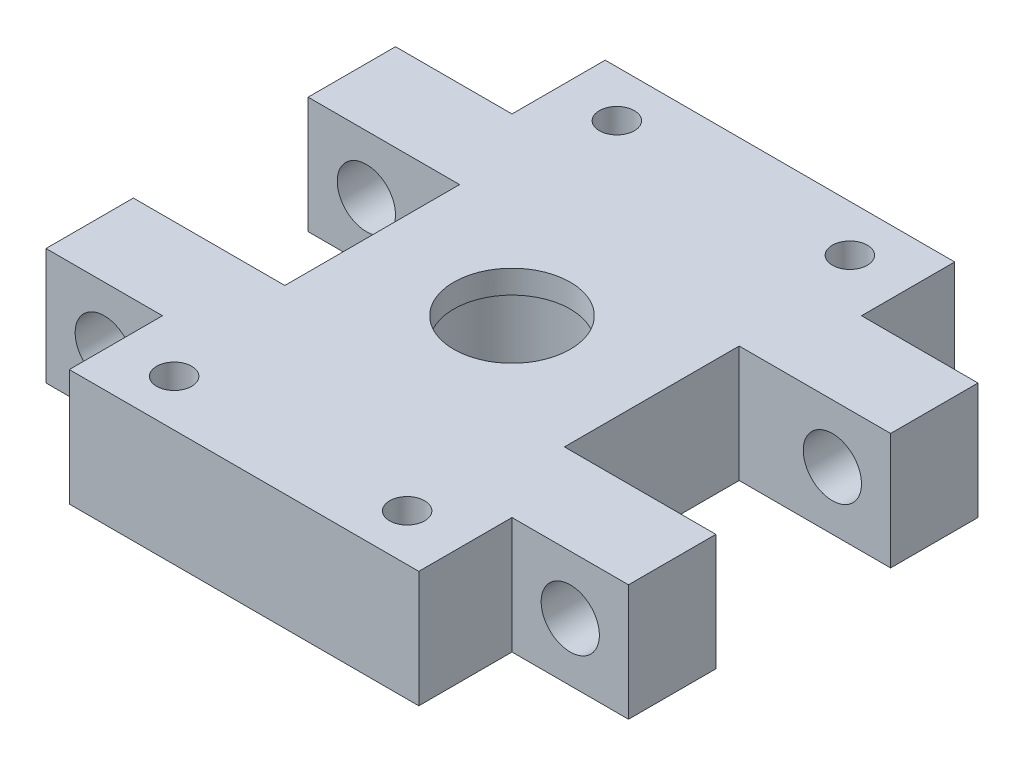
ISO-10303-21;
HEADER;
FILE_DESCRIPTION(('STEP AP214'),'2;1');
FILE_NAME('part.step','',(''),(''),'','','');
FILE_SCHEMA(('AUTOMOTIVE_DESIGN { 1 0 10303 214 1 1 1 1 }'));
ENDSEC;
DATA;
#1=APPLICATION_CONTEXT('core data for automotive mechanical design processes');
#2=APPLICATION_PROTOCOL_DEFINITION('international standard','automotive_design',2000,#1);
#3=PRODUCT_CONTEXT('',#1,'mechanical');
#4=PRODUCT('Part','Part','',(#3));
#5=PRODUCT_RELATED_PRODUCT_CATEGORY('part','',(#4));
#6=PRODUCT_DEFINITION_FORMATION('','',#4);
#7=PRODUCT_DEFINITION_CONTEXT('part definition',#1,'design');
#8=PRODUCT_DEFINITION('design','',#6,#7);
#9=PRODUCT_DEFINITION_SHAPE('','',#8);
#10=(LENGTH_UNIT() NAMED_UNIT(*) SI_UNIT(.MILLI.,.METRE.));
#11=(NAMED_UNIT(*) PLANE_ANGLE_UNIT() SI_UNIT($,.RADIAN.));
#12=(NAMED_UNIT(*) SI_UNIT($,.STERADIAN.) SOLID_ANGLE_UNIT());
#13=UNCERTAINTY_MEASURE_WITH_UNIT(LENGTH_MEASURE(1.E-05),#10,'distance_accuracy_value','');
#14=(GEOMETRIC_REPRESENTATION_CONTEXT(3) GLOBAL_UNCERTAINTY_ASSIGNED_CONTEXT((#13)) GLOBAL_UNIT_ASSIGNED_CONTEXT((#10,
#11,#12)) REPRESENTATION_CONTEXT('',''));
#15=CARTESIAN_POINT('',(0.,0.,0.));
#16=DIRECTION('',(0.,0.,1.));
#17=DIRECTION('',(1.,0.,0.));
#18=AXIS2_PLACEMENT_3D('',#15,#16,#17);
#19=CARTESIAN_POINT('',(0.,5.,0.));
#20=DIRECTION('',(0.,-1.,0.));
#21=DIRECTION('',(0.,0.,-1.));
#22=AXIS2_PLACEMENT_3D('',#19,#20,#21);
#23=CYLINDRICAL_SURFACE('',#22,5.);
#24=CARTESIAN_POINT('',(0.,5.,0.));
#25=DIRECTION('',(0.,1.,0.));
#26=DIRECTION('',(0.,0.,1.));
#27=AXIS2_PLACEMENT_3D('',#24,#25,#26);
#28=CIRCLE('',#27,5.);
#29=CARTESIAN_POINT('',(0.,5.,5.));
#30=VERTEX_POINT('',#29);
#31=EDGE_CURVE('E214',#30,#30,#28,.T.);
#32=ORIENTED_EDGE('',*,*,#31,.T.);
#33=EDGE_LOOP('',(#32));
#34=FACE_BOUND('',#33,.T.);
#35=CARTESIAN_POINT('',(0.,3.,0.));
#36=DIRECTION('',(0.,-1.,0.));
#37=DIRECTION('',(0.,0.,-1.));
#38=AXIS2_PLACEMENT_3D('',#35,#36,#37);
#39=CIRCLE('',#38,5.);
#40=CARTESIAN_POINT('',(0.,3.,-5.));
#41=VERTEX_POINT('',#40);
#42=EDGE_CURVE('E42',#41,#41,#39,.T.);
#43=ORIENTED_EDGE('',*,*,#42,.T.);
#44=EDGE_LOOP('',(#43));
#45=FACE_BOUND('',#44,.T.);
#46=ADVANCED_FACE('F38',(#34,#45),#23,.F.);
#47=CARTESIAN_POINT('',(0.,5.,0.));
#48=DIRECTION('',(0.,1.,0.));
#49=DIRECTION('',(0.,0.,1.));
#50=AXIS2_PLACEMENT_3D('',#47,#48,#49);
#51=PLANE('',#50);
#52=CARTESIAN_POINT('',(-9.99999999999998,5.,-19.));
#53=DIRECTION('',(0.,1.,0.));
#54=DIRECTION('',(0.,0.,-1.));
#55=AXIS2_PLACEMENT_3D('',#52,#53,#54);
#56=CIRCLE('',#55,1.5);
#57=CARTESIAN_POINT('',(-9.99999999999998,5.,-20.5));
#58=VERTEX_POINT('',#57);
#59=EDGE_CURVE('E717',#58,#58,#56,.T.);
#60=ORIENTED_EDGE('',*,*,#59,.F.);
#61=EDGE_LOOP('',(#60));
#62=FACE_BOUND('',#61,.T.);
#63=CARTESIAN_POINT('',(10.,5.,19.));
#64=DIRECTION('',(0.,1.,0.));
#65=DIRECTION('',(0.,0.,-1.));
#66=AXIS2_PLACEMENT_3D('',#63,#64,#65);
#67=CIRCLE('',#66,1.5);
#68=CARTESIAN_POINT('',(10.,5.,17.5));
#69=VERTEX_POINT('',#68);
#70=EDGE_CURVE('E720',#69,#69,#67,.T.);
#71=ORIENTED_EDGE('',*,*,#70,.F.);
#72=EDGE_LOOP('',(#71));
#73=FACE_BOUND('',#72,.T.);
#74=CARTESIAN_POINT('',(-9.99999999999998,5.,19.));
#75=DIRECTION('',(0.,1.,0.));
#76=DIRECTION('',(0.,0.,1.));
#77=AXIS2_PLACEMENT_3D('',#74,#75,#76);
#78=CIRCLE('',#77,1.5);
#79=CARTESIAN_POINT('',(-9.99999999999998,5.,20.5));
#80=VERTEX_POINT('',#79);
#81=EDGE_CURVE('E731',#80,#80,#78,.T.);
#82=ORIENTED_EDGE('',*,*,#81,.F.);
#83=EDGE_LOOP('',(#82));
#84=FACE_BOUND('',#83,.T.);
#85=CARTESIAN_POINT('',(10.,5.,-19.));
#86=DIRECTION('',(0.,1.,0.));
#87=DIRECTION('',(0.,0.,1.));
#88=AXIS2_PLACEMENT_3D('',#85,#86,#87);
#89=CIRCLE('',#88,1.5);
#90=CARTESIAN_POINT('',(10.,5.,-17.5));
#91=VERTEX_POINT('',#90);
#92=EDGE_CURVE('E423',#91,#91,#89,.T.);
#93=ORIENTED_EDGE('',*,*,#92,.F.);
#94=EDGE_LOOP('',(#93));
#95=FACE_BOUND('',#94,.T.);
#96=DIRECTION('',(0.,0.,-1.));
#97=VECTOR('',#96,1.);
#98=CARTESIAN_POINT('',(25.,5.,7.5));
#99=LINE('',#98,#97);
#100=CARTESIAN_POINT('',(25.,5.,15.));
#101=VERTEX_POINT('',#100);
#102=CARTESIAN_POINT('',(25.,5.,7.5));
#103=VERTEX_POINT('',#102);
#104=EDGE_CURVE('E249',#101,#103,#99,.T.);
#105=ORIENTED_EDGE('',*,*,#104,.T.);
#106=DIRECTION('',(-1.,0.,0.));
#107=VECTOR('',#106,1.);
#108=CARTESIAN_POINT('',(12.,5.,7.5));
#109=LINE('',#108,#107);
#110=CARTESIAN_POINT('',(12.,5.,7.5));
#111=VERTEX_POINT('',#110);
#112=EDGE_CURVE('E136',#103,#111,#109,.T.);
#113=ORIENTED_EDGE('',*,*,#112,.T.);
#114=DIRECTION('',(0.,0.,-1.));
#115=VECTOR('',#114,1.);
#116=CARTESIAN_POINT('',(12.,5.,-7.5));
#117=LINE('',#116,#115);
#118=CARTESIAN_POINT('',(12.,5.,-7.5));
#119=VERTEX_POINT('',#118);
#120=EDGE_CURVE('E324',#111,#119,#117,.T.);
#121=ORIENTED_EDGE('',*,*,#120,.T.);
#122=DIRECTION('',(1.,0.,0.));
#123=VECTOR('',#122,1.);
#124=CARTESIAN_POINT('',(12.,5.,-7.5));
#125=LINE('',#124,#123);
#126=CARTESIAN_POINT('',(25.,5.,-7.5));
#127=VERTEX_POINT('',#126);
#128=EDGE_CURVE('E326',#119,#127,#125,.T.);
#129=ORIENTED_EDGE('',*,*,#128,.T.);
#130=DIRECTION('',(0.,0.,-1.));
#131=VECTOR('',#130,1.);
#132=CARTESIAN_POINT('',(25.,5.,-15.));
#133=LINE('',#132,#131);
#134=CARTESIAN_POINT('',(25.,5.,-15.));
#135=VERTEX_POINT('',#134);
#136=EDGE_CURVE('E328',#127,#135,#133,.T.);
#137=ORIENTED_EDGE('',*,*,#136,.T.);
#138=DIRECTION('',(-1.,0.,0.));
#139=VECTOR('',#138,1.);
#140=CARTESIAN_POINT('',(15.,5.,-15.));
#141=LINE('',#140,#139);
#142=CARTESIAN_POINT('',(15.,5.,-15.));
#143=VERTEX_POINT('',#142);
#144=EDGE_CURVE('E330',#135,#143,#141,.T.);
#145=ORIENTED_EDGE('',*,*,#144,.T.);
#146=DIRECTION('',(0.,0.,-1.));
#147=VECTOR('',#146,1.);
#148=CARTESIAN_POINT('',(15.,5.,-23.));
#149=LINE('',#148,#147);
#150=CARTESIAN_POINT('',(15.,5.,-23.));
#151=VERTEX_POINT('',#150);
#152=EDGE_CURVE('E332',#143,#151,#149,.T.);
#153=ORIENTED_EDGE('',*,*,#152,.T.);
#154=DIRECTION('',(-1.,0.,0.));
#155=VECTOR('',#154,1.);
#156=CARTESIAN_POINT('',(-15.,5.,-23.));
#157=LINE('',#156,#155);
#158=CARTESIAN_POINT('',(-15.,5.,-23.));
#159=VERTEX_POINT('',#158);
#160=EDGE_CURVE('E334',#151,#159,#157,.T.);
#161=ORIENTED_EDGE('',*,*,#160,.T.);
#162=DIRECTION('',(0.,0.,1.));
#163=VECTOR('',#162,1.);
#164=CARTESIAN_POINT('',(-15.,5.,-15.));
#165=LINE('',#164,#163);
#166=CARTESIAN_POINT('',(-15.,5.,-15.));
#167=VERTEX_POINT('',#166);
#168=EDGE_CURVE('E336',#159,#167,#165,.T.);
#169=ORIENTED_EDGE('',*,*,#168,.T.);
#170=DIRECTION('',(-1.,0.,0.));
#171=VECTOR('',#170,1.);
#172=CARTESIAN_POINT('',(-25.,5.,-15.));
#173=LINE('',#172,#171);
#174=CARTESIAN_POINT('',(-25.,5.,-15.));
#175=VERTEX_POINT('',#174);
#176=EDGE_CURVE('E338',#167,#175,#173,.T.);
#177=ORIENTED_EDGE('',*,*,#176,.T.);
#178=DIRECTION('',(0.,0.,1.));
#179=VECTOR('',#178,1.);
#180=CARTESIAN_POINT('',(-25.,5.,-15.));
#181=LINE('',#180,#179);
#182=CARTESIAN_POINT('',(-25.,5.,-7.49999999999999));
#183=VERTEX_POINT('',#182);
#184=EDGE_CURVE('E340',#175,#183,#181,.T.);
#185=ORIENTED_EDGE('',*,*,#184,.T.);
#186=DIRECTION('',(1.,0.,0.));
#187=VECTOR('',#186,1.);
#188=CARTESIAN_POINT('',(-12.,5.,-7.5));
#189=LINE('',#188,#187);
#190=CARTESIAN_POINT('',(-12.,5.,-7.5));
#191=VERTEX_POINT('',#190);
#192=EDGE_CURVE('E342',#183,#191,#189,.T.);
#193=ORIENTED_EDGE('',*,*,#192,.T.);
#194=DIRECTION('',(0.,0.,1.));
#195=VECTOR('',#194,1.);
#196=CARTESIAN_POINT('',(-12.,5.,-7.5));
#197=LINE('',#196,#195);
#198=CARTESIAN_POINT('',(-12.,5.,7.5));
#199=VERTEX_POINT('',#198);
#200=EDGE_CURVE('E344',#191,#199,#197,.T.);
#201=ORIENTED_EDGE('',*,*,#200,.T.);
#202=DIRECTION('',(-1.,0.,0.));
#203=VECTOR('',#202,1.);
#204=CARTESIAN_POINT('',(-12.,5.,7.5));
#205=LINE('',#204,#203);
#206=CARTESIAN_POINT('',(-25.,5.,7.49999999999999));
#207=VERTEX_POINT('',#206);
#208=EDGE_CURVE('E346',#199,#207,#205,.T.);
#209=ORIENTED_EDGE('',*,*,#208,.T.);
#210=DIRECTION('',(0.,0.,1.));
#211=VECTOR('',#210,1.);
#212=CARTESIAN_POINT('',(-25.,5.,7.49999999999999));
#213=LINE('',#212,#211);
#214=CARTESIAN_POINT('',(-25.,5.,15.));
#215=VERTEX_POINT('',#214);
#216=EDGE_CURVE('E348',#207,#215,#213,.T.);
#217=ORIENTED_EDGE('',*,*,#216,.T.);
#218=DIRECTION('',(1.,0.,0.));
#219=VECTOR('',#218,1.);
#220=CARTESIAN_POINT('',(-25.,5.,15.));
#221=LINE('',#220,#219);
#222=CARTESIAN_POINT('',(-15.,5.,15.));
#223=VERTEX_POINT('',#222);
#224=EDGE_CURVE('E350',#215,#223,#221,.T.);
#225=ORIENTED_EDGE('',*,*,#224,.T.);
#226=DIRECTION('',(0.,0.,1.));
#227=VECTOR('',#226,1.);
#228=CARTESIAN_POINT('',(-15.,5.,15.));
#229=LINE('',#228,#227);
#230=CARTESIAN_POINT('',(-15.,5.,23.));
#231=VERTEX_POINT('',#230);
#232=EDGE_CURVE('E192',#223,#231,#229,.T.);
#233=ORIENTED_EDGE('',*,*,#232,.T.);
#234=DIRECTION('',(1.,0.,0.));
#235=VECTOR('',#234,1.);
#236=CARTESIAN_POINT('',(-15.,5.,23.));
#237=LINE('',#236,#235);
#238=CARTESIAN_POINT('',(15.,5.,23.));
#239=VERTEX_POINT('',#238);
#240=EDGE_CURVE('E185',#231,#239,#237,.T.);
#241=ORIENTED_EDGE('',*,*,#240,.T.);
#242=DIRECTION('',(0.,0.,-1.));
#243=VECTOR('',#242,1.);
#244=CARTESIAN_POINT('',(15.,5.,23.));
#245=LINE('',#244,#243);
#246=CARTESIAN_POINT('',(15.,5.,15.));
#247=VERTEX_POINT('',#246);
#248=EDGE_CURVE('E190',#239,#247,#245,.T.);
#249=ORIENTED_EDGE('',*,*,#248,.T.);
#250=DIRECTION('',(1.,0.,0.));
#251=VECTOR('',#250,1.);
#252=CARTESIAN_POINT('',(15.,5.,15.));
#253=LINE('',#252,#251);
#254=EDGE_CURVE('E57',#247,#101,#253,.T.);
#255=ORIENTED_EDGE('',*,*,#254,.T.);
#256=EDGE_LOOP('',(#105,#113,#121,#129,#137,#145,#153,#161,#169,#177,#185,#193,#201,#209,#217,
#225,#233,#241,#249,#255));
#257=FACE_BOUND('',#256,.T.);
#258=ORIENTED_EDGE('',*,*,#31,.F.);
#259=EDGE_LOOP('',(#258));
#260=FACE_BOUND('',#259,.T.);
#261=ADVANCED_FACE('F187',(#62,#73,#84,#95,#257,#260),#51,.T.);
#262=CARTESIAN_POINT('',(0.,-5.,0.));
#263=DIRECTION('',(0.,1.,0.));
#264=DIRECTION('',(0.,0.,1.));
#265=AXIS2_PLACEMENT_3D('',#262,#263,#264);
#266=PLANE('',#265);
#267=CARTESIAN_POINT('',(-9.99999999999998,-5.,-19.));
#268=DIRECTION('',(0.,1.,0.));
#269=DIRECTION('',(0.,0.,-1.));
#270=AXIS2_PLACEMENT_3D('',#267,#268,#269);
#271=CIRCLE('',#270,1.5);
#272=CARTESIAN_POINT('',(-9.99999999999998,-5.,-20.5));
#273=VERTEX_POINT('',#272);
#274=EDGE_CURVE('E402',#273,#273,#271,.T.);
#275=ORIENTED_EDGE('',*,*,#274,.T.);
#276=EDGE_LOOP('',(#275));
#277=FACE_BOUND('',#276,.T.);
#278=CARTESIAN_POINT('',(10.,-5.,19.));
#279=DIRECTION('',(0.,1.,0.));
#280=DIRECTION('',(0.,0.,-1.));
#281=AXIS2_PLACEMENT_3D('',#278,#279,#280);
#282=CIRCLE('',#281,1.5);
#283=CARTESIAN_POINT('',(10.,-5.,17.5));
#284=VERTEX_POINT('',#283);
#285=EDGE_CURVE('E406',#284,#284,#282,.T.);
#286=ORIENTED_EDGE('',*,*,#285,.T.);
#287=EDGE_LOOP('',(#286));
#288=FACE_BOUND('',#287,.T.);
#289=CARTESIAN_POINT('',(-9.99999999999998,-5.,19.));
#290=DIRECTION('',(0.,1.,0.));
#291=DIRECTION('',(0.,0.,1.));
#292=AXIS2_PLACEMENT_3D('',#289,#290,#291);
#293=CIRCLE('',#292,1.5);
#294=CARTESIAN_POINT('',(-9.99999999999998,-5.,20.5));
#295=VERTEX_POINT('',#294);
#296=EDGE_CURVE('E410',#295,#295,#293,.T.);
#297=ORIENTED_EDGE('',*,*,#296,.T.);
#298=EDGE_LOOP('',(#297));
#299=FACE_BOUND('',#298,.T.);
#300=CARTESIAN_POINT('',(10.,-5.,-19.));
#301=DIRECTION('',(0.,1.,0.));
#302=DIRECTION('',(0.,0.,1.));
#303=AXIS2_PLACEMENT_3D('',#300,#301,#302);
#304=CIRCLE('',#303,1.5);
#305=CARTESIAN_POINT('',(10.,-5.,-17.5));
#306=VERTEX_POINT('',#305);
#307=EDGE_CURVE('E414',#306,#306,#304,.T.);
#308=ORIENTED_EDGE('',*,*,#307,.T.);
#309=EDGE_LOOP('',(#308));
#310=FACE_BOUND('',#309,.T.);
#311=CARTESIAN_POINT('',(0.,-5.,0.));
#312=DIRECTION('',(0.,-1.,0.));
#313=DIRECTION('',(0.,0.,-1.));
#314=AXIS2_PLACEMENT_3D('',#311,#312,#313);
#315=CIRCLE('',#314,6.);
#316=CARTESIAN_POINT('',(0.,-5.,-6.));
#317=VERTEX_POINT('',#316);
#318=EDGE_CURVE('E417',#317,#317,#315,.T.);
#319=ORIENTED_EDGE('',*,*,#318,.F.);
#320=EDGE_LOOP('',(#319));
#321=FACE_BOUND('',#320,.T.);
#322=DIRECTION('',(0.,0.,-1.));
#323=VECTOR('',#322,1.);
#324=CARTESIAN_POINT('',(25.,-5.,7.5));
#325=LINE('',#324,#323);
#326=CARTESIAN_POINT('',(25.,-5.,15.));
#327=VERTEX_POINT('',#326);
#328=CARTESIAN_POINT('',(25.,-5.,7.5));
#329=VERTEX_POINT('',#328);
#330=EDGE_CURVE('E210',#327,#329,#325,.T.);
#331=ORIENTED_EDGE('',*,*,#330,.F.);
#332=DIRECTION('',(1.,0.,0.));
#333=VECTOR('',#332,1.);
#334=CARTESIAN_POINT('',(15.,-5.,15.));
#335=LINE('',#334,#333);
#336=CARTESIAN_POINT('',(15.,-5.,15.));
#337=VERTEX_POINT('',#336);
#338=EDGE_CURVE('E128',#337,#327,#335,.T.);
#339=ORIENTED_EDGE('',*,*,#338,.F.);
#340=DIRECTION('',(0.,0.,-1.));
#341=VECTOR('',#340,1.);
#342=CARTESIAN_POINT('',(15.,-5.,23.));
#343=LINE('',#342,#341);
#344=CARTESIAN_POINT('',(15.,-5.,23.));
#345=VERTEX_POINT('',#344);
#346=EDGE_CURVE('E122',#345,#337,#343,.T.);
#347=ORIENTED_EDGE('',*,*,#346,.F.);
#348=DIRECTION('',(1.,0.,0.));
#349=VECTOR('',#348,1.);
#350=CARTESIAN_POINT('',(-15.,-5.,23.));
#351=LINE('',#350,#349);
#352=CARTESIAN_POINT('',(-15.,-5.,23.));
#353=VERTEX_POINT('',#352);
#354=EDGE_CURVE('E200',#353,#345,#351,.T.);
#355=ORIENTED_EDGE('',*,*,#354,.F.);
#356=DIRECTION('',(0.,0.,1.));
#357=VECTOR('',#356,1.);
#358=CARTESIAN_POINT('',(-15.,-5.,15.));
#359=LINE('',#358,#357);
#360=CARTESIAN_POINT('',(-15.,-5.,15.));
#361=VERTEX_POINT('',#360);
#362=EDGE_CURVE('E244',#361,#353,#359,.T.);
#363=ORIENTED_EDGE('',*,*,#362,.F.);
#364=DIRECTION('',(1.,0.,0.));
#365=VECTOR('',#364,1.);
#366=CARTESIAN_POINT('',(-25.,-5.,15.));
#367=LINE('',#366,#365);
#368=CARTESIAN_POINT('',(-25.,-5.,15.));
#369=VERTEX_POINT('',#368);
#370=EDGE_CURVE('E242',#369,#361,#367,.T.);
#371=ORIENTED_EDGE('',*,*,#370,.F.);
#372=DIRECTION('',(0.,0.,1.));
#373=VECTOR('',#372,1.);
#374=CARTESIAN_POINT('',(-25.,-5.,7.49999999999999));
#375=LINE('',#374,#373);
#376=CARTESIAN_POINT('',(-25.,-5.,7.49999999999999));
#377=VERTEX_POINT('',#376);
#378=EDGE_CURVE('E240',#377,#369,#375,.T.);
#379=ORIENTED_EDGE('',*,*,#378,.F.);
#380=DIRECTION('',(-1.,0.,0.));
#381=VECTOR('',#380,1.);
#382=CARTESIAN_POINT('',(-12.,-5.,7.5));
#383=LINE('',#382,#381);
#384=CARTESIAN_POINT('',(-12.,-5.,7.5));
#385=VERTEX_POINT('',#384);
#386=EDGE_CURVE('E238',#385,#377,#383,.T.);
#387=ORIENTED_EDGE('',*,*,#386,.F.);
#388=DIRECTION('',(0.,0.,1.));
#389=VECTOR('',#388,1.);
#390=CARTESIAN_POINT('',(-12.,-5.,-7.5));
#391=LINE('',#390,#389);
#392=CARTESIAN_POINT('',(-12.,-5.,-7.5));
#393=VERTEX_POINT('',#392);
#394=EDGE_CURVE('E236',#393,#385,#391,.T.);
#395=ORIENTED_EDGE('',*,*,#394,.F.);
#396=DIRECTION('',(1.,0.,0.));
#397=VECTOR('',#396,1.);
#398=CARTESIAN_POINT('',(-12.,-5.,-7.5));
#399=LINE('',#398,#397);
#400=CARTESIAN_POINT('',(-25.,-5.,-7.49999999999999));
#401=VERTEX_POINT('',#400);
#402=EDGE_CURVE('E234',#401,#393,#399,.T.);
#403=ORIENTED_EDGE('',*,*,#402,.F.);
#404=DIRECTION('',(0.,0.,1.));
#405=VECTOR('',#404,1.);
#406=CARTESIAN_POINT('',(-25.,-5.,-15.));
#407=LINE('',#406,#405);
#408=CARTESIAN_POINT('',(-25.,-5.,-15.));
#409=VERTEX_POINT('',#408);
#410=EDGE_CURVE('E232',#409,#401,#407,.T.);
#411=ORIENTED_EDGE('',*,*,#410,.F.);
#412=DIRECTION('',(-1.,0.,0.));
#413=VECTOR('',#412,1.);
#414=CARTESIAN_POINT('',(-25.,-5.,-15.));
#415=LINE('',#414,#413);
#416=CARTESIAN_POINT('',(-15.,-5.,-15.));
#417=VERTEX_POINT('',#416);
#418=EDGE_CURVE('E230',#417,#409,#415,.T.);
#419=ORIENTED_EDGE('',*,*,#418,.F.);
#420=DIRECTION('',(0.,0.,1.));
#421=VECTOR('',#420,1.);
#422=CARTESIAN_POINT('',(-15.,-5.,-15.));
#423=LINE('',#422,#421);
#424=CARTESIAN_POINT('',(-15.,-5.,-23.));
#425=VERTEX_POINT('',#424);
#426=EDGE_CURVE('E228',#425,#417,#423,.T.);
#427=ORIENTED_EDGE('',*,*,#426,.F.);
#428=DIRECTION('',(-1.,0.,0.));
#429=VECTOR('',#428,1.);
#430=CARTESIAN_POINT('',(-15.,-5.,-23.));
#431=LINE('',#430,#429);
#432=CARTESIAN_POINT('',(15.,-5.,-23.));
#433=VERTEX_POINT('',#432);
#434=EDGE_CURVE('E226',#433,#425,#431,.T.);
#435=ORIENTED_EDGE('',*,*,#434,.F.);
#436=DIRECTION('',(0.,0.,-1.));
#437=VECTOR('',#436,1.);
#438=CARTESIAN_POINT('',(15.,-5.,-23.));
#439=LINE('',#438,#437);
#440=CARTESIAN_POINT('',(15.,-5.,-15.));
#441=VERTEX_POINT('',#440);
#442=EDGE_CURVE('E224',#441,#433,#439,.T.);
#443=ORIENTED_EDGE('',*,*,#442,.F.);
#444=DIRECTION('',(-1.,0.,0.));
#445=VECTOR('',#444,1.);
#446=CARTESIAN_POINT('',(15.,-5.,-15.));
#447=LINE('',#446,#445);
#448=CARTESIAN_POINT('',(25.,-5.,-15.));
#449=VERTEX_POINT('',#448);
#450=EDGE_CURVE('E222',#449,#441,#447,.T.);
#451=ORIENTED_EDGE('',*,*,#450,.F.);
#452=DIRECTION('',(0.,0.,-1.));
#453=VECTOR('',#452,1.);
#454=CARTESIAN_POINT('',(25.,-5.,-15.));
#455=LINE('',#454,#453);
#456=CARTESIAN_POINT('',(25.,-5.,-7.5));
#457=VERTEX_POINT('',#456);
#458=EDGE_CURVE('E220',#457,#449,#455,.T.);
#459=ORIENTED_EDGE('',*,*,#458,.F.);
#460=DIRECTION('',(1.,0.,0.));
#461=VECTOR('',#460,1.);
#462=CARTESIAN_POINT('',(12.,-5.,-7.5));
#463=LINE('',#462,#461);
#464=CARTESIAN_POINT('',(12.,-5.,-7.5));
#465=VERTEX_POINT('',#464);
#466=EDGE_CURVE('E218',#465,#457,#463,.T.);
#467=ORIENTED_EDGE('',*,*,#466,.F.);
#468=DIRECTION('',(0.,0.,-1.));
#469=VECTOR('',#468,1.);
#470=CARTESIAN_POINT('',(12.,-5.,-7.5));
#471=LINE('',#470,#469);
#472=CARTESIAN_POINT('',(12.,-5.,7.5));
#473=VERTEX_POINT('',#472);
#474=EDGE_CURVE('E216',#473,#465,#471,.T.);
#475=ORIENTED_EDGE('',*,*,#474,.F.);
#476=DIRECTION('',(-1.,0.,0.));
#477=VECTOR('',#476,1.);
#478=CARTESIAN_POINT('',(12.,-5.,7.5));
#479=LINE('',#478,#477);
#480=EDGE_CURVE('E213',#329,#473,#479,.T.);
#481=ORIENTED_EDGE('',*,*,#480,.F.);
#482=EDGE_LOOP('',(#331,#339,#347,#355,#363,#371,#379,#387,#395,#403,#411,#419,#427,#435,#443,
#451,#459,#467,#475,#481));
#483=FACE_BOUND('',#482,.T.);
#484=ADVANCED_FACE('F363',(#277,#288,#299,#310,#321,#483),#266,.F.);
#485=CARTESIAN_POINT('',(25.,5.,7.5));
#486=DIRECTION('',(-1.,0.,0.));
#487=DIRECTION('',(0.,0.,1.));
#488=AXIS2_PLACEMENT_3D('',#485,#486,#487);
#489=PLANE('',#488);
#490=ORIENTED_EDGE('',*,*,#330,.T.);
#491=DIRECTION('',(0.,-1.,0.));
#492=VECTOR('',#491,1.);
#493=CARTESIAN_POINT('',(25.,5.,7.5));
#494=LINE('',#493,#492);
#495=EDGE_CURVE('E11',#103,#329,#494,.T.);
#496=ORIENTED_EDGE('',*,*,#495,.F.);
#497=ORIENTED_EDGE('',*,*,#104,.F.);
#498=DIRECTION('',(0.,-1.,0.));
#499=VECTOR('',#498,1.);
#500=CARTESIAN_POINT('',(25.,5.,15.));
#501=LINE('',#500,#499);
#502=EDGE_CURVE('E206',#101,#327,#501,.T.);
#503=ORIENTED_EDGE('',*,*,#502,.T.);
#504=EDGE_LOOP('',(#490,#496,#497,#503));
#505=FACE_BOUND('',#504,.T.);
#506=ADVANCED_FACE('F40',(#505),#489,.F.);
#507=CARTESIAN_POINT('',(12.,5.,7.5));
#508=DIRECTION('',(0.,0.,1.));
#509=DIRECTION('',(1.,0.,0.));
#510=AXIS2_PLACEMENT_3D('',#507,#508,#509);
#511=PLANE('',#510);
#512=CARTESIAN_POINT('',(20.,0.,7.5));
#513=DIRECTION('',(0.,0.,1.));
#514=DIRECTION('',(1.,0.,0.));
#515=AXIS2_PLACEMENT_3D('',#512,#513,#514);
#516=CIRCLE('',#515,2.50000000000002);
#517=CARTESIAN_POINT('',(22.5,0.,7.5));
#518=VERTEX_POINT('',#517);
#519=EDGE_CURVE('E304',#518,#518,#516,.T.);
#520=ORIENTED_EDGE('',*,*,#519,.T.);
#521=EDGE_LOOP('',(#520));
#522=FACE_BOUND('',#521,.T.);
#523=ORIENTED_EDGE('',*,*,#480,.T.);
#524=DIRECTION('',(0.,-1.,0.));
#525=VECTOR('',#524,1.);
#526=CARTESIAN_POINT('',(12.,5.,7.5));
#527=LINE('',#526,#525);
#528=EDGE_CURVE('E48',#111,#473,#527,.T.);
#529=ORIENTED_EDGE('',*,*,#528,.F.);
#530=ORIENTED_EDGE('',*,*,#112,.F.);
#531=ORIENTED_EDGE('',*,*,#495,.T.);
#532=EDGE_LOOP('',(#523,#529,#530,#531));
#533=FACE_BOUND('',#532,.T.);
#534=ADVANCED_FACE('F398',(#522,#533),#511,.F.);
#535=CARTESIAN_POINT('',(12.,5.,-7.5));
#536=DIRECTION('',(-1.,0.,0.));
#537=DIRECTION('',(0.,0.,1.));
#538=AXIS2_PLACEMENT_3D('',#535,#536,#537);
#539=PLANE('',#538);
#540=ORIENTED_EDGE('',*,*,#474,.T.);
#541=DIRECTION('',(0.,-1.,0.));
#542=VECTOR('',#541,1.);
#543=CARTESIAN_POINT('',(12.,5.,-7.5));
#544=LINE('',#543,#542);
#545=EDGE_CURVE('E292',#119,#465,#544,.T.);
#546=ORIENTED_EDGE('',*,*,#545,.F.);
#547=ORIENTED_EDGE('',*,*,#120,.F.);
#548=ORIENTED_EDGE('',*,*,#528,.T.);
#549=EDGE_LOOP('',(#540,#546,#547,#548));
#550=FACE_BOUND('',#549,.T.);
#551=ADVANCED_FACE('F526',(#550),#539,.F.);
#552=CARTESIAN_POINT('',(12.,5.,-7.5));
#553=DIRECTION('',(0.,0.,-1.));
#554=DIRECTION('',(-1.,0.,0.));
#555=AXIS2_PLACEMENT_3D('',#552,#553,#554);
#556=PLANE('',#555);
#557=CARTESIAN_POINT('',(20.,0.,-7.5));
#558=DIRECTION('',(0.,0.,-1.));
#559=DIRECTION('',(-1.,0.,0.));
#560=AXIS2_PLACEMENT_3D('',#557,#558,#559);
#561=CIRCLE('',#560,2.50000000000002);
#562=CARTESIAN_POINT('',(17.5,0.,-7.5));
#563=VERTEX_POINT('',#562);
#564=EDGE_CURVE('E299',#563,#563,#561,.T.);
#565=ORIENTED_EDGE('',*,*,#564,.T.);
#566=EDGE_LOOP('',(#565));
#567=FACE_BOUND('',#566,.T.);
#568=ORIENTED_EDGE('',*,*,#466,.T.);
#569=DIRECTION('',(0.,-1.,0.));
#570=VECTOR('',#569,1.);
#571=CARTESIAN_POINT('',(25.,5.,-7.5));
#572=LINE('',#571,#570);
#573=EDGE_CURVE('E289',#127,#457,#572,.T.);
#574=ORIENTED_EDGE('',*,*,#573,.F.);
#575=ORIENTED_EDGE('',*,*,#128,.F.);
#576=ORIENTED_EDGE('',*,*,#545,.T.);
#577=EDGE_LOOP('',(#568,#574,#575,#576));
#578=FACE_BOUND('',#577,.T.);
#579=ADVANCED_FACE('F522',(#567,#578),#556,.F.);
#580=CARTESIAN_POINT('',(25.,5.,-15.));
#581=DIRECTION('',(-1.,0.,0.));
#582=DIRECTION('',(0.,0.,1.));
#583=AXIS2_PLACEMENT_3D('',#580,#581,#582);
#584=PLANE('',#583);
#585=ORIENTED_EDGE('',*,*,#458,.T.);
#586=DIRECTION('',(0.,-1.,0.));
#587=VECTOR('',#586,1.);
#588=CARTESIAN_POINT('',(25.,5.,-15.));
#589=LINE('',#588,#587);
#590=EDGE_CURVE('E286',#135,#449,#589,.T.);
#591=ORIENTED_EDGE('',*,*,#590,.F.);
#592=ORIENTED_EDGE('',*,*,#136,.F.);
#593=ORIENTED_EDGE('',*,*,#573,.T.);
#594=EDGE_LOOP('',(#585,#591,#592,#593));
#595=FACE_BOUND('',#594,.T.);
#596=ADVANCED_FACE('F518',(#595),#584,.F.);
#597=CARTESIAN_POINT('',(15.,5.,-15.));
#598=DIRECTION('',(0.,0.,1.));
#599=DIRECTION('',(1.,0.,0.));
#600=AXIS2_PLACEMENT_3D('',#597,#598,#599);
#601=PLANE('',#600);
#602=CARTESIAN_POINT('',(20.,0.,-15.));
#603=DIRECTION('',(0.,0.,-1.));
#604=DIRECTION('',(1.,0.,0.));
#605=AXIS2_PLACEMENT_3D('',#602,#603,#604);
#606=CIRCLE('',#605,2.50000000000002);
#607=CARTESIAN_POINT('',(22.5,0.,-15.));
#608=VERTEX_POINT('',#607);
#609=EDGE_CURVE('E428',#608,#608,#606,.T.);
#610=ORIENTED_EDGE('',*,*,#609,.F.);
#611=EDGE_LOOP('',(#610));
#612=FACE_BOUND('',#611,.T.);
#613=ORIENTED_EDGE('',*,*,#450,.T.);
#614=DIRECTION('',(0.,-1.,0.));
#615=VECTOR('',#614,1.);
#616=CARTESIAN_POINT('',(15.,5.,-15.));
#617=LINE('',#616,#615);
#618=EDGE_CURVE('E283',#143,#441,#617,.T.);
#619=ORIENTED_EDGE('',*,*,#618,.F.);
#620=ORIENTED_EDGE('',*,*,#144,.F.);
#621=ORIENTED_EDGE('',*,*,#590,.T.);
#622=EDGE_LOOP('',(#613,#619,#620,#621));
#623=FACE_BOUND('',#622,.T.);
#624=ADVANCED_FACE('F514',(#612,#623),#601,.F.);
#625=CARTESIAN_POINT('',(15.,5.,-23.));
#626=DIRECTION('',(-1.,0.,0.));
#627=DIRECTION('',(0.,0.,1.));
#628=AXIS2_PLACEMENT_3D('',#625,#626,#627);
#629=PLANE('',#628);
#630=ORIENTED_EDGE('',*,*,#442,.T.);
#631=DIRECTION('',(0.,-1.,0.));
#632=VECTOR('',#631,1.);
#633=CARTESIAN_POINT('',(15.,5.,-23.));
#634=LINE('',#633,#632);
#635=EDGE_CURVE('E280',#151,#433,#634,.T.);
#636=ORIENTED_EDGE('',*,*,#635,.F.);
#637=ORIENTED_EDGE('',*,*,#152,.F.);
#638=ORIENTED_EDGE('',*,*,#618,.T.);
#639=EDGE_LOOP('',(#630,#636,#637,#638));
#640=FACE_BOUND('',#639,.T.);
#641=ADVANCED_FACE('F510',(#640),#629,.F.);
#642=CARTESIAN_POINT('',(-15.,5.,-23.));
#643=DIRECTION('',(0.,0.,1.));
#644=DIRECTION('',(1.,0.,0.));
#645=AXIS2_PLACEMENT_3D('',#642,#643,#644);
#646=PLANE('',#645);
#647=ORIENTED_EDGE('',*,*,#434,.T.);
#648=DIRECTION('',(0.,-1.,0.));
#649=VECTOR('',#648,1.);
#650=CARTESIAN_POINT('',(-15.,5.,-23.));
#651=LINE('',#650,#649);
#652=EDGE_CURVE('E277',#159,#425,#651,.T.);
#653=ORIENTED_EDGE('',*,*,#652,.F.);
#654=ORIENTED_EDGE('',*,*,#160,.F.);
#655=ORIENTED_EDGE('',*,*,#635,.T.);
#656=EDGE_LOOP('',(#647,#653,#654,#655));
#657=FACE_BOUND('',#656,.T.);
#658=ADVANCED_FACE('F506',(#657),#646,.F.);
#659=CARTESIAN_POINT('',(-15.,5.,-15.));
#660=DIRECTION('',(1.,0.,0.));
#661=DIRECTION('',(0.,0.,-1.));
#662=AXIS2_PLACEMENT_3D('',#659,#660,#661);
#663=PLANE('',#662);
#664=ORIENTED_EDGE('',*,*,#426,.T.);
#665=DIRECTION('',(0.,-1.,0.));
#666=VECTOR('',#665,1.);
#667=CARTESIAN_POINT('',(-15.,5.,-15.));
#668=LINE('',#667,#666);
#669=EDGE_CURVE('E274',#167,#417,#668,.T.);
#670=ORIENTED_EDGE('',*,*,#669,.F.);
#671=ORIENTED_EDGE('',*,*,#168,.F.);
#672=ORIENTED_EDGE('',*,*,#652,.T.);
#673=EDGE_LOOP('',(#664,#670,#671,#672));
#674=FACE_BOUND('',#673,.T.);
#675=ADVANCED_FACE('F502',(#674),#663,.F.);
#676=CARTESIAN_POINT('',(-25.,5.,-15.));
#677=DIRECTION('',(0.,0.,1.));
#678=DIRECTION('',(1.,0.,0.));
#679=AXIS2_PLACEMENT_3D('',#676,#677,#678);
#680=PLANE('',#679);
#681=CARTESIAN_POINT('',(-20.,0.,-15.));
#682=DIRECTION('',(0.,0.,-1.));
#683=DIRECTION('',(-1.,0.,0.));
#684=AXIS2_PLACEMENT_3D('',#681,#682,#683);
#685=CIRCLE('',#684,2.5);
#686=CARTESIAN_POINT('',(-22.5,0.,-15.));
#687=VERTEX_POINT('',#686);
#688=EDGE_CURVE('E300',#687,#687,#685,.T.);
#689=ORIENTED_EDGE('',*,*,#688,.F.);
#690=EDGE_LOOP('',(#689));
#691=FACE_BOUND('',#690,.T.);
#692=ORIENTED_EDGE('',*,*,#418,.T.);
#693=DIRECTION('',(0.,-1.,0.));
#694=VECTOR('',#693,1.);
#695=CARTESIAN_POINT('',(-25.,5.,-15.));
#696=LINE('',#695,#694);
#697=EDGE_CURVE('E271',#175,#409,#696,.T.);
#698=ORIENTED_EDGE('',*,*,#697,.F.);
#699=ORIENTED_EDGE('',*,*,#176,.F.);
#700=ORIENTED_EDGE('',*,*,#669,.T.);
#701=EDGE_LOOP('',(#692,#698,#699,#700));
#702=FACE_BOUND('',#701,.T.);
#703=ADVANCED_FACE('F498',(#691,#702),#680,.F.);
#704=CARTESIAN_POINT('',(-25.,5.,-15.));
#705=DIRECTION('',(1.,0.,0.));
#706=DIRECTION('',(0.,0.,-1.));
#707=AXIS2_PLACEMENT_3D('',#704,#705,#706);
#708=PLANE('',#707);
#709=ORIENTED_EDGE('',*,*,#410,.T.);
#710=DIRECTION('',(0.,-1.,0.));
#711=VECTOR('',#710,1.);
#712=CARTESIAN_POINT('',(-25.,5.,-7.49999999999999));
#713=LINE('',#712,#711);
#714=EDGE_CURVE('E268',#183,#401,#713,.T.);
#715=ORIENTED_EDGE('',*,*,#714,.F.);
#716=ORIENTED_EDGE('',*,*,#184,.F.);
#717=ORIENTED_EDGE('',*,*,#697,.T.);
#718=EDGE_LOOP('',(#709,#715,#716,#717));
#719=FACE_BOUND('',#718,.T.);
#720=ADVANCED_FACE('F464',(#719),#708,.F.);
#721=CARTESIAN_POINT('',(-12.,5.,-7.5));
#722=DIRECTION('',(0.,0.,-1.));
#723=DIRECTION('',(-1.,0.,0.));
#724=AXIS2_PLACEMENT_3D('',#721,#722,#723);
#725=PLANE('',#724);
#726=CARTESIAN_POINT('',(-20.,0.,-7.49999999999999));
#727=DIRECTION('',(0.,0.,-1.));
#728=DIRECTION('',(-1.,0.,0.));
#729=AXIS2_PLACEMENT_3D('',#726,#727,#728);
#730=CIRCLE('',#729,2.5);
#731=CARTESIAN_POINT('',(-22.5,0.,-7.49999999999999));
#732=VERTEX_POINT('',#731);
#733=EDGE_CURVE('E308',#732,#732,#730,.T.);
#734=ORIENTED_EDGE('',*,*,#733,.T.);
#735=EDGE_LOOP('',(#734));
#736=FACE_BOUND('',#735,.T.);
#737=ORIENTED_EDGE('',*,*,#402,.T.);
#738=DIRECTION('',(0.,-1.,0.));
#739=VECTOR('',#738,1.);
#740=CARTESIAN_POINT('',(-12.,5.,-7.5));
#741=LINE('',#740,#739);
#742=EDGE_CURVE('E265',#191,#393,#741,.T.);
#743=ORIENTED_EDGE('',*,*,#742,.F.);
#744=ORIENTED_EDGE('',*,*,#192,.F.);
#745=ORIENTED_EDGE('',*,*,#714,.T.);
#746=EDGE_LOOP('',(#737,#743,#744,#745));
#747=FACE_BOUND('',#746,.T.);
#748=ADVANCED_FACE('F460',(#736,#747),#725,.F.);
#749=CARTESIAN_POINT('',(-12.,5.,-7.5));
#750=DIRECTION('',(1.,0.,0.));
#751=DIRECTION('',(0.,0.,-1.));
#752=AXIS2_PLACEMENT_3D('',#749,#750,#751);
#753=PLANE('',#752);
#754=ORIENTED_EDGE('',*,*,#394,.T.);
#755=DIRECTION('',(0.,-1.,0.));
#756=VECTOR('',#755,1.);
#757=CARTESIAN_POINT('',(-12.,5.,7.5));
#758=LINE('',#757,#756);
#759=EDGE_CURVE('E262',#199,#385,#758,.T.);
#760=ORIENTED_EDGE('',*,*,#759,.F.);
#761=ORIENTED_EDGE('',*,*,#200,.F.);
#762=ORIENTED_EDGE('',*,*,#742,.T.);
#763=EDGE_LOOP('',(#754,#760,#761,#762));
#764=FACE_BOUND('',#763,.T.);
#765=ADVANCED_FACE('F463',(#764),#753,.F.);
#766=CARTESIAN_POINT('',(-12.,5.,7.5));
#767=DIRECTION('',(0.,0.,1.));
#768=DIRECTION('',(1.,0.,0.));
#769=AXIS2_PLACEMENT_3D('',#766,#767,#768);
#770=PLANE('',#769);
#771=CARTESIAN_POINT('',(-20.,0.,7.49999999999999));
#772=DIRECTION('',(0.,0.,1.));
#773=DIRECTION('',(1.,0.,0.));
#774=AXIS2_PLACEMENT_3D('',#771,#772,#773);
#775=CIRCLE('',#774,2.5);
#776=CARTESIAN_POINT('',(-17.5,0.,7.5));
#777=VERTEX_POINT('',#776);
#778=EDGE_CURVE('E303',#777,#777,#775,.T.);
#779=ORIENTED_EDGE('',*,*,#778,.T.);
#780=EDGE_LOOP('',(#779));
#781=FACE_BOUND('',#780,.T.);
#782=ORIENTED_EDGE('',*,*,#386,.T.);
#783=DIRECTION('',(0.,-1.,0.));
#784=VECTOR('',#783,1.);
#785=CARTESIAN_POINT('',(-25.,5.,7.49999999999999));
#786=LINE('',#785,#784);
#787=EDGE_CURVE('E259',#207,#377,#786,.T.);
#788=ORIENTED_EDGE('',*,*,#787,.F.);
#789=ORIENTED_EDGE('',*,*,#208,.F.);
#790=ORIENTED_EDGE('',*,*,#759,.T.);
#791=EDGE_LOOP('',(#782,#788,#789,#790));
#792=FACE_BOUND('',#791,.T.);
#793=ADVANCED_FACE('F479',(#781,#792),#770,.F.);
#794=CARTESIAN_POINT('',(-25.,5.,7.49999999999999));
#795=DIRECTION('',(1.,0.,0.));
#796=DIRECTION('',(0.,0.,-1.));
#797=AXIS2_PLACEMENT_3D('',#794,#795,#796);
#798=PLANE('',#797);
#799=ORIENTED_EDGE('',*,*,#378,.T.);
#800=DIRECTION('',(0.,-1.,0.));
#801=VECTOR('',#800,1.);
#802=CARTESIAN_POINT('',(-25.,5.,15.));
#803=LINE('',#802,#801);
#804=EDGE_CURVE('E256',#215,#369,#803,.T.);
#805=ORIENTED_EDGE('',*,*,#804,.F.);
#806=ORIENTED_EDGE('',*,*,#216,.F.);
#807=ORIENTED_EDGE('',*,*,#787,.T.);
#808=EDGE_LOOP('',(#799,#805,#806,#807));
#809=FACE_BOUND('',#808,.T.);
#810=ADVANCED_FACE('F482',(#809),#798,.F.);
#811=CARTESIAN_POINT('',(-25.,5.,15.));
#812=DIRECTION('',(0.,0.,-1.));
#813=DIRECTION('',(-1.,0.,0.));
#814=AXIS2_PLACEMENT_3D('',#811,#812,#813);
#815=PLANE('',#814);
#816=CARTESIAN_POINT('',(-20.,0.,15.));
#817=DIRECTION('',(0.,0.,-1.));
#818=DIRECTION('',(-1.,0.,0.));
#819=AXIS2_PLACEMENT_3D('',#816,#817,#818);
#820=CIRCLE('',#819,2.5);
#821=CARTESIAN_POINT('',(-22.5,0.,15.));
#822=VERTEX_POINT('',#821);
#823=EDGE_CURVE('E301',#822,#822,#820,.T.);
#824=ORIENTED_EDGE('',*,*,#823,.T.);
#825=EDGE_LOOP('',(#824));
#826=FACE_BOUND('',#825,.T.);
#827=ORIENTED_EDGE('',*,*,#370,.T.);
#828=DIRECTION('',(0.,-1.,0.));
#829=VECTOR('',#828,1.);
#830=CARTESIAN_POINT('',(-15.,5.,15.));
#831=LINE('',#830,#829);
#832=EDGE_CURVE('E253',#223,#361,#831,.T.);
#833=ORIENTED_EDGE('',*,*,#832,.F.);
#834=ORIENTED_EDGE('',*,*,#224,.F.);
#835=ORIENTED_EDGE('',*,*,#804,.T.);
#836=EDGE_LOOP('',(#827,#833,#834,#835));
#837=FACE_BOUND('',#836,.T.);
#838=ADVANCED_FACE('F356',(#826,#837),#815,.F.);
#839=CARTESIAN_POINT('',(-15.,5.,15.));
#840=DIRECTION('',(1.,0.,0.));
#841=DIRECTION('',(0.,0.,-1.));
#842=AXIS2_PLACEMENT_3D('',#839,#840,#841);
#843=PLANE('',#842);
#844=ORIENTED_EDGE('',*,*,#362,.T.);
#845=DIRECTION('',(0.,-1.,0.));
#846=VECTOR('',#845,1.);
#847=CARTESIAN_POINT('',(-15.,5.,23.));
#848=LINE('',#847,#846);
#849=EDGE_CURVE('E201',#231,#353,#848,.T.);
#850=ORIENTED_EDGE('',*,*,#849,.F.);
#851=ORIENTED_EDGE('',*,*,#232,.F.);
#852=ORIENTED_EDGE('',*,*,#832,.T.);
#853=EDGE_LOOP('',(#844,#850,#851,#852));
#854=FACE_BOUND('',#853,.T.);
#855=ADVANCED_FACE('F360',(#854),#843,.F.);
#856=CARTESIAN_POINT('',(-15.,5.,23.));
#857=DIRECTION('',(0.,0.,-1.));
#858=DIRECTION('',(-1.,0.,0.));
#859=AXIS2_PLACEMENT_3D('',#856,#857,#858);
#860=PLANE('',#859);
#861=ORIENTED_EDGE('',*,*,#354,.T.);
#862=DIRECTION('',(0.,-1.,0.));
#863=VECTOR('',#862,1.);
#864=CARTESIAN_POINT('',(15.,5.,23.));
#865=LINE('',#864,#863);
#866=EDGE_CURVE('E197',#239,#345,#865,.T.);
#867=ORIENTED_EDGE('',*,*,#866,.F.);
#868=ORIENTED_EDGE('',*,*,#240,.F.);
#869=ORIENTED_EDGE('',*,*,#849,.T.);
#870=EDGE_LOOP('',(#861,#867,#868,#869));
#871=FACE_BOUND('',#870,.T.);
#872=ADVANCED_FACE('F198',(#871),#860,.F.);
#873=CARTESIAN_POINT('',(15.,5.,23.));
#874=DIRECTION('',(-1.,0.,0.));
#875=DIRECTION('',(0.,0.,1.));
#876=AXIS2_PLACEMENT_3D('',#873,#874,#875);
#877=PLANE('',#876);
#878=ORIENTED_EDGE('',*,*,#346,.T.);
#879=DIRECTION('',(0.,-1.,0.));
#880=VECTOR('',#879,1.);
#881=CARTESIAN_POINT('',(15.,5.,15.));
#882=LINE('',#881,#880);
#883=EDGE_CURVE('E202',#247,#337,#882,.T.);
#884=ORIENTED_EDGE('',*,*,#883,.F.);
#885=ORIENTED_EDGE('',*,*,#248,.F.);
#886=ORIENTED_EDGE('',*,*,#866,.T.);
#887=EDGE_LOOP('',(#878,#884,#885,#886));
#888=FACE_BOUND('',#887,.T.);
#889=ADVANCED_FACE('F204',(#888),#877,.F.);
#890=CARTESIAN_POINT('',(15.,5.,15.));
#891=DIRECTION('',(0.,0.,-1.));
#892=DIRECTION('',(-1.,0.,0.));
#893=AXIS2_PLACEMENT_3D('',#890,#891,#892);
#894=PLANE('',#893);
#895=CARTESIAN_POINT('',(20.,0.,15.));
#896=DIRECTION('',(0.,0.,-1.));
#897=DIRECTION('',(-1.,0.,0.));
#898=AXIS2_PLACEMENT_3D('',#895,#896,#897);
#899=CIRCLE('',#898,2.50000000000002);
#900=CARTESIAN_POINT('',(17.5,0.,15.));
#901=VERTEX_POINT('',#900);
#902=EDGE_CURVE('E297',#901,#901,#899,.T.);
#903=ORIENTED_EDGE('',*,*,#902,.T.);
#904=EDGE_LOOP('',(#903));
#905=FACE_BOUND('',#904,.T.);
#906=ORIENTED_EDGE('',*,*,#338,.T.);
#907=ORIENTED_EDGE('',*,*,#502,.F.);
#908=ORIENTED_EDGE('',*,*,#254,.F.);
#909=ORIENTED_EDGE('',*,*,#883,.T.);
#910=EDGE_LOOP('',(#906,#907,#908,#909));
#911=FACE_BOUND('',#910,.T.);
#912=ADVANCED_FACE('F368',(#905,#911),#894,.F.);
#913=CARTESIAN_POINT('',(20.,0.,23.));
#914=DIRECTION('',(0.,0.,-1.));
#915=DIRECTION('',(-1.,0.,0.));
#916=AXIS2_PLACEMENT_3D('',#913,#914,#915);
#917=CYLINDRICAL_SURFACE('',#916,2.50000000000002);
#918=ORIENTED_EDGE('',*,*,#902,.F.);
#919=EDGE_LOOP('',(#918));
#920=FACE_BOUND('',#919,.T.);
#921=ORIENTED_EDGE('',*,*,#519,.F.);
#922=EDGE_LOOP('',(#921));
#923=FACE_BOUND('',#922,.T.);
#924=ADVANCED_FACE('F370',(#920,#923),#917,.F.);
#925=CARTESIAN_POINT('',(-20.,0.,23.));
#926=DIRECTION('',(0.,0.,-1.));
#927=DIRECTION('',(-1.,0.,0.));
#928=AXIS2_PLACEMENT_3D('',#925,#926,#927);
#929=CYLINDRICAL_SURFACE('',#928,2.5);
#930=ORIENTED_EDGE('',*,*,#823,.F.);
#931=EDGE_LOOP('',(#930));
#932=FACE_BOUND('',#931,.T.);
#933=ORIENTED_EDGE('',*,*,#778,.F.);
#934=EDGE_LOOP('',(#933));
#935=FACE_BOUND('',#934,.T.);
#936=ADVANCED_FACE('F377',(#932,#935),#929,.F.);
#937=ORIENTED_EDGE('',*,*,#688,.T.);
#938=EDGE_LOOP('',(#937));
#939=FACE_BOUND('',#938,.T.);
#940=ORIENTED_EDGE('',*,*,#733,.F.);
#941=EDGE_LOOP('',(#940));
#942=FACE_BOUND('',#941,.T.);
#943=ADVANCED_FACE('F448',(#939,#942),#929,.F.);
#944=ORIENTED_EDGE('',*,*,#609,.T.);
#945=EDGE_LOOP('',(#944));
#946=FACE_BOUND('',#945,.T.);
#947=ORIENTED_EDGE('',*,*,#564,.F.);
#948=EDGE_LOOP('',(#947));
#949=FACE_BOUND('',#948,.T.);
#950=ADVANCED_FACE('F380',(#946,#949),#917,.F.);
#951=CARTESIAN_POINT('',(0.,3.,0.));
#952=DIRECTION('',(0.,-1.,0.));
#953=DIRECTION('',(0.,0.,-1.));
#954=AXIS2_PLACEMENT_3D('',#951,#952,#953);
#955=CYLINDRICAL_SURFACE('',#954,6.);
#956=CARTESIAN_POINT('',(0.,3.,0.));
#957=DIRECTION('',(0.,-1.,0.));
#958=DIRECTION('',(0.,0.,-1.));
#959=AXIS2_PLACEMENT_3D('',#956,#957,#958);
#960=CIRCLE('',#959,6.);
#961=CARTESIAN_POINT('',(0.,3.,-6.));
#962=VERTEX_POINT('',#961);
#963=EDGE_CURVE('E419',#962,#962,#960,.T.);
#964=ORIENTED_EDGE('',*,*,#963,.F.);
#965=EDGE_LOOP('',(#964));
#966=FACE_BOUND('',#965,.T.);
#967=ORIENTED_EDGE('',*,*,#318,.T.);
#968=EDGE_LOOP('',(#967));
#969=FACE_BOUND('',#968,.T.);
#970=ADVANCED_FACE('F439',(#966,#969),#955,.F.);
#971=CARTESIAN_POINT('',(0.,3.,0.));
#972=DIRECTION('',(0.,-1.,0.));
#973=DIRECTION('',(0.,0.,-1.));
#974=AXIS2_PLACEMENT_3D('',#971,#972,#973);
#975=PLANE('',#974);
#976=ORIENTED_EDGE('',*,*,#42,.F.);
#977=EDGE_LOOP('',(#976));
#978=FACE_BOUND('',#977,.T.);
#979=ORIENTED_EDGE('',*,*,#963,.T.);
#980=EDGE_LOOP('',(#979));
#981=FACE_BOUND('',#980,.T.);
#982=ADVANCED_FACE('F435',(#978,#981),#975,.T.);
#983=CARTESIAN_POINT('',(10.,-5.,-19.));
#984=DIRECTION('',(0.,1.,0.));
#985=DIRECTION('',(0.,0.,1.));
#986=AXIS2_PLACEMENT_3D('',#983,#984,#985);
#987=CYLINDRICAL_SURFACE('',#986,1.5);
#988=ORIENTED_EDGE('',*,*,#307,.F.);
#989=EDGE_LOOP('',(#988));
#990=FACE_BOUND('',#989,.T.);
#991=ORIENTED_EDGE('',*,*,#92,.T.);
#992=EDGE_LOOP('',(#991));
#993=FACE_BOUND('',#992,.T.);
#994=ADVANCED_FACE('F438',(#990,#993),#987,.F.);
#995=CARTESIAN_POINT('',(-9.99999999999998,-5.,19.));
#996=DIRECTION('',(0.,1.,0.));
#997=DIRECTION('',(0.,0.,1.));
#998=AXIS2_PLACEMENT_3D('',#995,#996,#997);
#999=CYLINDRICAL_SURFACE('',#998,1.5);
#1000=ORIENTED_EDGE('',*,*,#296,.F.);
#1001=EDGE_LOOP('',(#1000));
#1002=FACE_BOUND('',#1001,.T.);
#1003=ORIENTED_EDGE('',*,*,#81,.T.);
#1004=EDGE_LOOP('',(#1003));
#1005=FACE_BOUND('',#1004,.T.);
#1006=ADVANCED_FACE('F681',(#1002,#1005),#999,.F.);
#1007=CARTESIAN_POINT('',(10.,-5.,19.));
#1008=DIRECTION('',(0.,1.,0.));
#1009=DIRECTION('',(0.,0.,1.));
#1010=AXIS2_PLACEMENT_3D('',#1007,#1008,#1009);
#1011=CYLINDRICAL_SURFACE('',#1010,1.5);
#1012=ORIENTED_EDGE('',*,*,#285,.F.);
#1013=EDGE_LOOP('',(#1012));
#1014=FACE_BOUND('',#1013,.T.);
#1015=ORIENTED_EDGE('',*,*,#70,.T.);
#1016=EDGE_LOOP('',(#1015));
#1017=FACE_BOUND('',#1016,.T.);
#1018=ADVANCED_FACE('F690',(#1014,#1017),#1011,.F.);
#1019=CARTESIAN_POINT('',(-9.99999999999998,-5.,-19.));
#1020=DIRECTION('',(0.,1.,0.));
#1021=DIRECTION('',(0.,0.,1.));
#1022=AXIS2_PLACEMENT_3D('',#1019,#1020,#1021);
#1023=CYLINDRICAL_SURFACE('',#1022,1.5);
#1024=ORIENTED_EDGE('',*,*,#274,.F.);
#1025=EDGE_LOOP('',(#1024));
#1026=FACE_BOUND('',#1025,.T.);
#1027=ORIENTED_EDGE('',*,*,#59,.T.);
#1028=EDGE_LOOP('',(#1027));
#1029=FACE_BOUND('',#1028,.T.);
#1030=ADVANCED_FACE('F700',(#1026,#1029),#1023,.F.);
#1031=CLOSED_SHELL('',(#46,#261,#484,#506,#534,#551,#579,#596,#624,#641,#658,#675,#703,#720,
#748,#765,#793,#810,#838,#855,#872,#889,#912,#924,#936,#943,#950,#970,#982,#994,#1006,#1018,#1030));
#1032=MANIFOLD_SOLID_BREP('B2',#1031);
#1033=ADVANCED_BREP_SHAPE_REPRESENTATION('',(#18,#1032),#14);
#1034=SHAPE_DEFINITION_REPRESENTATION(#9,#1033);
ENDSEC;
END-ISO-10303-21;
